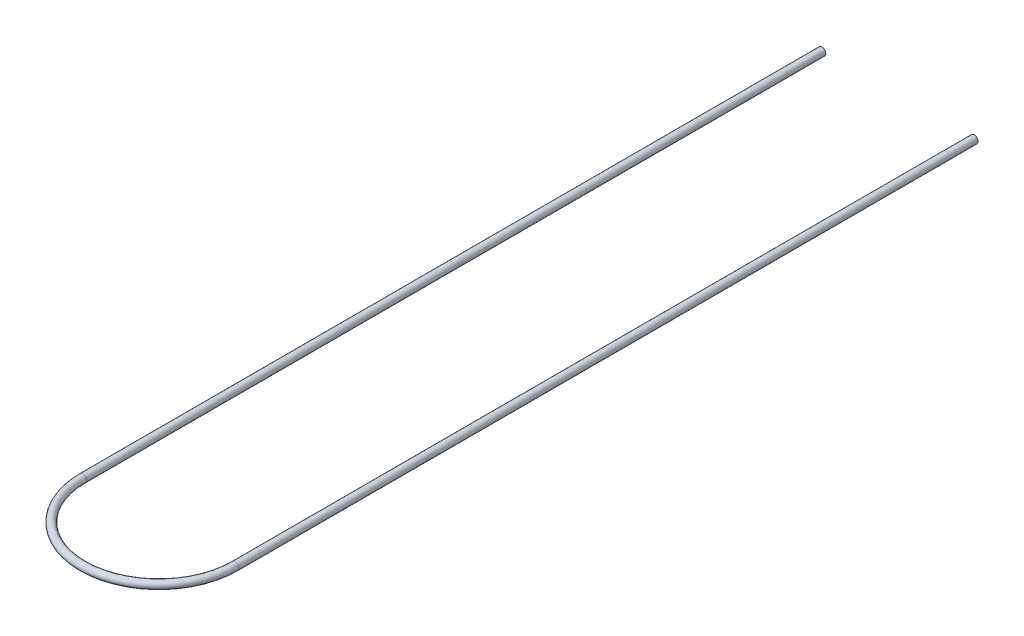
ISO-10303-21;
HEADER;
FILE_DESCRIPTION(('STEP AP214'),'2;1');
FILE_NAME('part.step','',(''),(''),'','','');
FILE_SCHEMA(('AUTOMOTIVE_DESIGN { 1 0 10303 214 1 1 1 1 }'));
ENDSEC;
DATA;
#1=APPLICATION_CONTEXT('core data for automotive mechanical design processes');
#2=APPLICATION_PROTOCOL_DEFINITION('international standard','automotive_design',2000,#1);
#3=PRODUCT_CONTEXT('',#1,'mechanical');
#4=PRODUCT('Part','Part','',(#3));
#5=PRODUCT_RELATED_PRODUCT_CATEGORY('part','',(#4));
#6=PRODUCT_DEFINITION_FORMATION('','',#4);
#7=PRODUCT_DEFINITION_CONTEXT('part definition',#1,'design');
#8=PRODUCT_DEFINITION('design','',#6,#7);
#9=PRODUCT_DEFINITION_SHAPE('','',#8);
#10=(LENGTH_UNIT() NAMED_UNIT(*) SI_UNIT(.MILLI.,.METRE.));
#11=(NAMED_UNIT(*) PLANE_ANGLE_UNIT() SI_UNIT($,.RADIAN.));
#12=(NAMED_UNIT(*) SI_UNIT($,.STERADIAN.) SOLID_ANGLE_UNIT());
#13=UNCERTAINTY_MEASURE_WITH_UNIT(LENGTH_MEASURE(1.E-05),#10,'distance_accuracy_value','');
#14=(GEOMETRIC_REPRESENTATION_CONTEXT(3) GLOBAL_UNCERTAINTY_ASSIGNED_CONTEXT((#13)) GLOBAL_UNIT_ASSIGNED_CONTEXT((#10,
#11,#12)) REPRESENTATION_CONTEXT('',''));
#15=CARTESIAN_POINT('',(0.,0.,0.));
#16=DIRECTION('',(0.,0.,1.));
#17=DIRECTION('',(1.,0.,0.));
#18=AXIS2_PLACEMENT_3D('',#15,#16,#17);
#19=CARTESIAN_POINT('',(-40.,0.,299.999999999999));
#20=DIRECTION('',(0.,0.,1.));
#21=DIRECTION('',(1.,0.,0.));
#22=AXIS2_PLACEMENT_3D('',#19,#20,#21);
#23=CYLINDRICAL_SURFACE('',#22,11.1);
#24=CARTESIAN_POINT('',(-39.9999999999997,0.,2440.));
#25=DIRECTION('',(0.,0.,1.));
#26=DIRECTION('',(1.,0.,0.));
#27=AXIS2_PLACEMENT_3D('',#24,#25,#26);
#28=CIRCLE('',#27,11.1);
#29=CARTESIAN_POINT('',(-51.0999999999997,0.,2440.));
#30=VERTEX_POINT('',#29);
#31=EDGE_CURVE('E54',#30,#30,#28,.T.);
#32=ORIENTED_EDGE('',*,*,#31,.F.);
#33=EDGE_LOOP('',(#32));
#34=FACE_BOUND('',#33,.T.);
#35=CARTESIAN_POINT('',(-40.,0.,299.999999999999));
#36=DIRECTION('',(0.,0.,1.));
#37=DIRECTION('',(1.,0.,0.));
#38=AXIS2_PLACEMENT_3D('',#35,#36,#37);
#39=CIRCLE('',#38,11.1);
#40=CARTESIAN_POINT('',(-28.9,0.,299.999999999999));
#41=VERTEX_POINT('',#40);
#42=EDGE_CURVE('E52',#41,#41,#39,.T.);
#43=ORIENTED_EDGE('',*,*,#42,.T.);
#44=EDGE_LOOP('',(#43));
#45=FACE_BOUND('',#44,.T.);
#46=ADVANCED_FACE('F31',(#34,#45),#23,.T.);
#47=CARTESIAN_POINT('',(180.31,0.,2440.));
#48=DIRECTION('',(0.,1.,0.));
#49=DIRECTION('',(0.,0.,1.));
#50=AXIS2_PLACEMENT_3D('',#47,#48,#49);
#51=TOROIDAL_SURFACE('',#50,220.31,11.1);
#52=CARTESIAN_POINT('',(400.62,0.,2440.));
#53=DIRECTION('',(0.,0.,-1.));
#54=DIRECTION('',(-1.,0.,0.));
#55=AXIS2_PLACEMENT_3D('',#52,#53,#54);
#56=CIRCLE('',#55,11.1);
#57=CARTESIAN_POINT('',(411.72,0.,2440.));
#58=VERTEX_POINT('',#57);
#59=EDGE_CURVE('E35',#58,#58,#56,.T.);
#60=CARTESIAN_POINT('',(180.31,0.,2440.));
#61=DIRECTION('',(0.,1.,0.));
#62=DIRECTION('',(0.,0.,1.));
#63=AXIS2_PLACEMENT_3D('',#60,#61,#62);
#64=CIRCLE('',#63,231.41);
#65=EDGE_CURVE('',#30,#58,#64,.T.);
#66=ORIENTED_EDGE('',*,*,#31,.T.);
#67=ORIENTED_EDGE('',*,*,#59,.F.);
#68=ORIENTED_EDGE('',*,*,#65,.T.);
#69=ORIENTED_EDGE('',*,*,#65,.F.);
#70=EDGE_LOOP('',(#66,#68,#67,#69));
#71=FACE_BOUND('',#70,.T.);
#72=ADVANCED_FACE('F62',(#71),#51,.T.);
#73=CARTESIAN_POINT('',(400.62,0.,2440.));
#74=DIRECTION('',(0.,0.,-1.));
#75=DIRECTION('',(-1.,0.,0.));
#76=AXIS2_PLACEMENT_3D('',#73,#74,#75);
#77=CYLINDRICAL_SURFACE('',#76,11.1);
#78=CARTESIAN_POINT('',(400.62,0.,299.999999999999));
#79=DIRECTION('',(0.,0.,-1.));
#80=DIRECTION('',(-1.,0.,0.));
#81=AXIS2_PLACEMENT_3D('',#78,#79,#80);
#82=CIRCLE('',#81,11.1);
#83=CARTESIAN_POINT('',(389.52,0.,299.999999999999));
#84=VERTEX_POINT('',#83);
#85=EDGE_CURVE('E48',#84,#84,#82,.T.);
#86=ORIENTED_EDGE('',*,*,#85,.F.);
#87=EDGE_LOOP('',(#86));
#88=FACE_BOUND('',#87,.T.);
#89=ORIENTED_EDGE('',*,*,#59,.T.);
#90=EDGE_LOOP('',(#89));
#91=FACE_BOUND('',#90,.T.);
#92=ADVANCED_FACE('F33',(#88,#91),#77,.T.);
#93=CARTESIAN_POINT('',(-40.,0.,299.999999999999));
#94=DIRECTION('',(0.,0.,1.));
#95=DIRECTION('',(1.,0.,0.));
#96=AXIS2_PLACEMENT_3D('',#93,#94,#95);
#97=PLANE('',#96);
#98=CARTESIAN_POINT('',(-40.,0.,299.999999999999));
#99=DIRECTION('',(0.,0.,1.));
#100=DIRECTION('',(1.,0.,0.));
#101=AXIS2_PLACEMENT_3D('',#98,#99,#100);
#102=CIRCLE('',#101,9.95000000000001);
#103=CARTESIAN_POINT('',(-30.05,0.,299.999999999999));
#104=VERTEX_POINT('',#103);
#105=EDGE_CURVE('E51',#104,#104,#102,.F.);
#106=ORIENTED_EDGE('',*,*,#105,.F.);
#107=EDGE_LOOP('',(#106));
#108=FACE_BOUND('',#107,.T.);
#109=ORIENTED_EDGE('',*,*,#42,.F.);
#110=EDGE_LOOP('',(#109));
#111=FACE_BOUND('',#110,.T.);
#112=ADVANCED_FACE('F68',(#108,#111),#97,.F.);
#113=CARTESIAN_POINT('',(400.62,0.,299.999999999999));
#114=DIRECTION('',(0.,0.,-1.));
#115=DIRECTION('',(-1.,0.,0.));
#116=AXIS2_PLACEMENT_3D('',#113,#114,#115);
#117=PLANE('',#116);
#118=CARTESIAN_POINT('',(400.62,0.,299.999999999999));
#119=DIRECTION('',(0.,0.,-1.));
#120=DIRECTION('',(-1.,0.,0.));
#121=AXIS2_PLACEMENT_3D('',#118,#119,#120);
#122=CIRCLE('',#121,9.95000000000001);
#123=CARTESIAN_POINT('',(390.67,0.,299.999999999999));
#124=VERTEX_POINT('',#123);
#125=EDGE_CURVE('E10',#124,#124,#122,.F.);
#126=ORIENTED_EDGE('',*,*,#125,.T.);
#127=EDGE_LOOP('',(#126));
#128=FACE_BOUND('',#127,.T.);
#129=ORIENTED_EDGE('',*,*,#85,.T.);
#130=EDGE_LOOP('',(#129));
#131=FACE_BOUND('',#130,.T.);
#132=ADVANCED_FACE('F86',(#128,#131),#117,.T.);
#133=CARTESIAN_POINT('',(-40.,0.,299.999999999999));
#134=DIRECTION('',(0.,0.,1.));
#135=DIRECTION('',(1.,0.,0.));
#136=AXIS2_PLACEMENT_3D('',#133,#134,#135);
#137=CYLINDRICAL_SURFACE('',#136,9.95000000000001);
#138=CARTESIAN_POINT('',(-39.9999999999997,0.,2440.));
#139=DIRECTION('',(0.,0.,1.));
#140=DIRECTION('',(1.,0.,0.));
#141=AXIS2_PLACEMENT_3D('',#138,#139,#140);
#142=CIRCLE('',#141,9.95000000000001);
#143=CARTESIAN_POINT('',(-49.9499999999997,0.,2440.));
#144=VERTEX_POINT('',#143);
#145=EDGE_CURVE('E44',#144,#144,#142,.F.);
#146=ORIENTED_EDGE('',*,*,#145,.F.);
#147=EDGE_LOOP('',(#146));
#148=FACE_BOUND('',#147,.T.);
#149=ORIENTED_EDGE('',*,*,#105,.T.);
#150=EDGE_LOOP('',(#149));
#151=FACE_BOUND('',#150,.T.);
#152=ADVANCED_FACE('F80',(#148,#151),#137,.F.);
#153=CARTESIAN_POINT('',(180.31,0.,2440.));
#154=DIRECTION('',(0.,1.,0.));
#155=DIRECTION('',(0.,0.,1.));
#156=AXIS2_PLACEMENT_3D('',#153,#154,#155);
#157=TOROIDAL_SURFACE('',#156,220.31,9.95000000000001);
#158=CARTESIAN_POINT('',(400.62,0.,2440.));
#159=DIRECTION('',(0.,0.,-1.));
#160=DIRECTION('',(-1.,0.,0.));
#161=AXIS2_PLACEMENT_3D('',#158,#159,#160);
#162=CIRCLE('',#161,9.95000000000001);
#163=CARTESIAN_POINT('',(410.57,0.,2440.));
#164=VERTEX_POINT('',#163);
#165=EDGE_CURVE('E39',#164,#164,#162,.F.);
#166=CARTESIAN_POINT('',(180.31,0.,2440.));
#167=DIRECTION('',(0.,1.,0.));
#168=DIRECTION('',(0.,0.,1.));
#169=AXIS2_PLACEMENT_3D('',#166,#167,#168);
#170=CIRCLE('',#169,230.26);
#171=EDGE_CURVE('',#144,#164,#170,.T.);
#172=ORIENTED_EDGE('',*,*,#145,.T.);
#173=ORIENTED_EDGE('',*,*,#165,.F.);
#174=ORIENTED_EDGE('',*,*,#171,.T.);
#175=ORIENTED_EDGE('',*,*,#171,.F.);
#176=EDGE_LOOP('',(#172,#174,#173,#175));
#177=FACE_BOUND('',#176,.T.);
#178=ADVANCED_FACE('F74',(#177),#157,.F.);
#179=CARTESIAN_POINT('',(400.62,0.,2440.));
#180=DIRECTION('',(0.,0.,-1.));
#181=DIRECTION('',(-1.,0.,0.));
#182=AXIS2_PLACEMENT_3D('',#179,#180,#181);
#183=CYLINDRICAL_SURFACE('',#182,9.95000000000001);
#184=ORIENTED_EDGE('',*,*,#125,.F.);
#185=EDGE_LOOP('',(#184));
#186=FACE_BOUND('',#185,.T.);
#187=ORIENTED_EDGE('',*,*,#165,.T.);
#188=EDGE_LOOP('',(#187));
#189=FACE_BOUND('',#188,.T.);
#190=ADVANCED_FACE('F72',(#186,#189),#183,.F.);
#191=CLOSED_SHELL('',(#46,#72,#92,#112,#132,#152,#178,#190));
#192=MANIFOLD_SOLID_BREP('B2',#191);
#193=ADVANCED_BREP_SHAPE_REPRESENTATION('',(#18,#192),#14);
#194=SHAPE_DEFINITION_REPRESENTATION(#9,#193);
ENDSEC;
END-ISO-10303-21;
